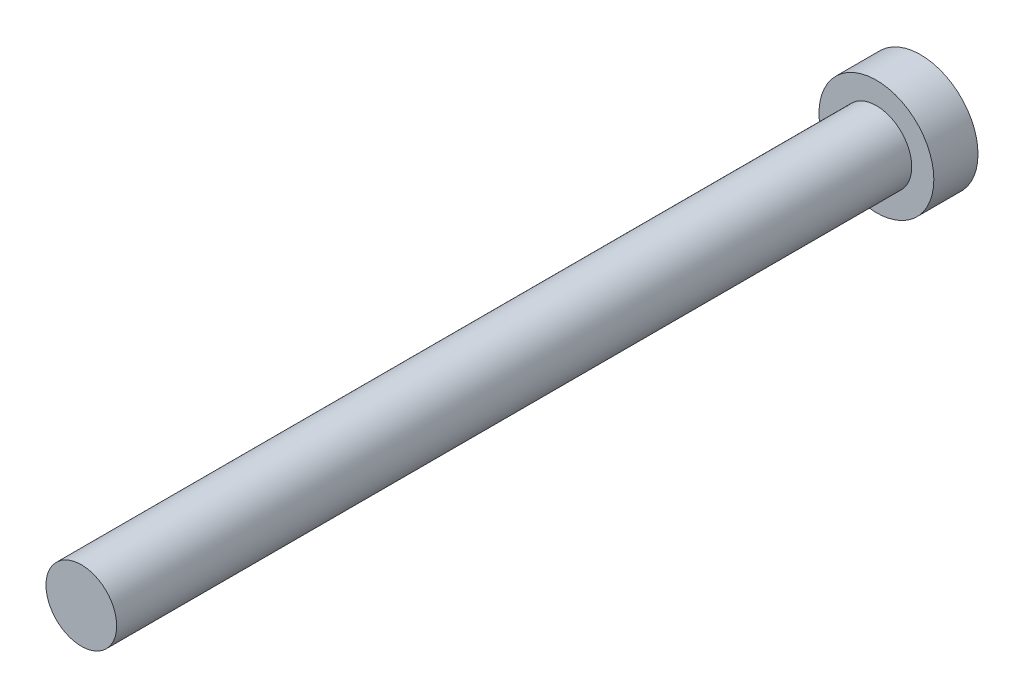
ISO-10303-21;
HEADER;
FILE_DESCRIPTION(('STEP AP214'),'2;1');
FILE_NAME('part.step','',(''),(''),'','','');
FILE_SCHEMA(('AUTOMOTIVE_DESIGN { 1 0 10303 214 1 1 1 1 }'));
ENDSEC;
DATA;
#1=APPLICATION_CONTEXT('core data for automotive mechanical design processes');
#2=APPLICATION_PROTOCOL_DEFINITION('international standard','automotive_design',2000,#1);
#3=PRODUCT_CONTEXT('',#1,'mechanical');
#4=PRODUCT('Part','Part','',(#3));
#5=PRODUCT_RELATED_PRODUCT_CATEGORY('part','',(#4));
#6=PRODUCT_DEFINITION_FORMATION('','',#4);
#7=PRODUCT_DEFINITION_CONTEXT('part definition',#1,'design');
#8=PRODUCT_DEFINITION('design','',#6,#7);
#9=PRODUCT_DEFINITION_SHAPE('','',#8);
#10=(LENGTH_UNIT() NAMED_UNIT(*) SI_UNIT(.MILLI.,.METRE.));
#11=(NAMED_UNIT(*) PLANE_ANGLE_UNIT() SI_UNIT($,.RADIAN.));
#12=(NAMED_UNIT(*) SI_UNIT($,.STERADIAN.) SOLID_ANGLE_UNIT());
#13=UNCERTAINTY_MEASURE_WITH_UNIT(LENGTH_MEASURE(1.E-05),#10,'distance_accuracy_value','');
#14=(GEOMETRIC_REPRESENTATION_CONTEXT(3) GLOBAL_UNCERTAINTY_ASSIGNED_CONTEXT((#13)) GLOBAL_UNIT_ASSIGNED_CONTEXT((#10,
#11,#12)) REPRESENTATION_CONTEXT('',''));
#15=CARTESIAN_POINT('',(0.,0.,0.));
#16=DIRECTION('',(0.,0.,1.));
#17=DIRECTION('',(1.,0.,0.));
#18=AXIS2_PLACEMENT_3D('',#15,#16,#17);
#19=CARTESIAN_POINT('',(0.,0.,5.));
#20=DIRECTION('',(0.,0.,-1.));
#21=DIRECTION('',(-1.,0.,0.));
#22=AXIS2_PLACEMENT_3D('',#19,#20,#21);
#23=CYLINDRICAL_SURFACE('',#22,6.5);
#24=CARTESIAN_POINT('',(0.,0.,5.));
#25=DIRECTION('',(0.,0.,1.));
#26=DIRECTION('',(1.,0.,0.));
#27=AXIS2_PLACEMENT_3D('',#24,#25,#26);
#28=CIRCLE('',#27,6.5);
#29=CARTESIAN_POINT('',(6.5,0.,5.));
#30=VERTEX_POINT('',#29);
#31=EDGE_CURVE('E45',#30,#30,#28,.T.);
#32=ORIENTED_EDGE('',*,*,#31,.F.);
#33=EDGE_LOOP('',(#32));
#34=FACE_BOUND('',#33,.T.);
#35=CARTESIAN_POINT('',(0.,0.,0.));
#36=DIRECTION('',(0.,0.,1.));
#37=DIRECTION('',(1.,0.,0.));
#38=AXIS2_PLACEMENT_3D('',#35,#36,#37);
#39=CIRCLE('',#38,6.5);
#40=CARTESIAN_POINT('',(6.5,0.,0.));
#41=VERTEX_POINT('',#40);
#42=EDGE_CURVE('E40',#41,#41,#39,.T.);
#43=ORIENTED_EDGE('',*,*,#42,.T.);
#44=EDGE_LOOP('',(#43));
#45=FACE_BOUND('',#44,.T.);
#46=ADVANCED_FACE('F37',(#34,#45),#23,.T.);
#47=CARTESIAN_POINT('',(0.,0.,5.));
#48=DIRECTION('',(0.,0.,1.));
#49=DIRECTION('',(1.,0.,0.));
#50=AXIS2_PLACEMENT_3D('',#47,#48,#49);
#51=PLANE('',#50);
#52=CARTESIAN_POINT('',(0.,0.,5.));
#53=DIRECTION('',(0.,0.,1.));
#54=DIRECTION('',(1.,0.,0.));
#55=AXIS2_PLACEMENT_3D('',#52,#53,#54);
#56=CIRCLE('',#55,4.);
#57=CARTESIAN_POINT('',(-4.,0.,4.99999999999999));
#58=VERTEX_POINT('',#57);
#59=EDGE_CURVE('E10',#58,#58,#56,.T.);
#60=ORIENTED_EDGE('',*,*,#59,.F.);
#61=EDGE_LOOP('',(#60));
#62=FACE_BOUND('',#61,.T.);
#63=ORIENTED_EDGE('',*,*,#31,.T.);
#64=EDGE_LOOP('',(#63));
#65=FACE_BOUND('',#64,.T.);
#66=ADVANCED_FACE('F65',(#62,#65),#51,.T.);
#67=CARTESIAN_POINT('',(0.,0.,0.));
#68=DIRECTION('',(0.,0.,1.));
#69=DIRECTION('',(1.,0.,0.));
#70=AXIS2_PLACEMENT_3D('',#67,#68,#69);
#71=PLANE('',#70);
#72=ORIENTED_EDGE('',*,*,#42,.F.);
#73=EDGE_LOOP('',(#72));
#74=FACE_BOUND('',#73,.T.);
#75=ADVANCED_FACE('F62',(#74),#71,.F.);
#76=CARTESIAN_POINT('',(0.,0.,95.));
#77=DIRECTION('',(0.,0.,-1.));
#78=DIRECTION('',(-1.,0.,0.));
#79=AXIS2_PLACEMENT_3D('',#76,#77,#78);
#80=CYLINDRICAL_SURFACE('',#79,4.);
#81=CARTESIAN_POINT('',(0.,0.,95.));
#82=DIRECTION('',(0.,0.,1.));
#83=DIRECTION('',(1.,0.,0.));
#84=AXIS2_PLACEMENT_3D('',#81,#82,#83);
#85=CIRCLE('',#84,4.);
#86=CARTESIAN_POINT('',(-4.,0.,95.));
#87=VERTEX_POINT('',#86);
#88=EDGE_CURVE('E52',#87,#87,#85,.T.);
#89=CARTESIAN_POINT('',(-4.,0.,95.));
#90=CARTESIAN_POINT('',(-4.,0.,94.0625));
#91=CARTESIAN_POINT('',(-4.,0.,93.125));
#92=CARTESIAN_POINT('',(-4.,0.,91.25));
#93=CARTESIAN_POINT('',(-4.,0.,90.3125));
#94=CARTESIAN_POINT('',(-4.,0.,88.4375));
#95=CARTESIAN_POINT('',(-4.,0.,87.5));
#96=CARTESIAN_POINT('',(-4.,0.,85.625));
#97=CARTESIAN_POINT('',(-4.,0.,84.6875));
#98=CARTESIAN_POINT('',(-4.,0.,82.8125));
#99=CARTESIAN_POINT('',(-4.,0.,81.875));
#100=CARTESIAN_POINT('',(-4.,0.,80.));
#101=CARTESIAN_POINT('',(-4.,0.,79.0625));
#102=CARTESIAN_POINT('',(-4.,0.,77.1875));
#103=CARTESIAN_POINT('',(-4.,0.,76.25));
#104=CARTESIAN_POINT('',(-4.,0.,74.375));
#105=CARTESIAN_POINT('',(-4.,0.,73.4375));
#106=CARTESIAN_POINT('',(-4.,0.,71.5625));
#107=CARTESIAN_POINT('',(-4.,0.,70.625));
#108=CARTESIAN_POINT('',(-4.,0.,68.75));
#109=CARTESIAN_POINT('',(-4.,0.,67.8125));
#110=CARTESIAN_POINT('',(-4.,0.,65.9375));
#111=CARTESIAN_POINT('',(-4.,0.,65.));
#112=CARTESIAN_POINT('',(-4.,0.,63.125));
#113=CARTESIAN_POINT('',(-4.,0.,62.1875));
#114=CARTESIAN_POINT('',(-4.,0.,60.3125));
#115=CARTESIAN_POINT('',(-4.,0.,59.375));
#116=CARTESIAN_POINT('',(-4.,0.,57.5));
#117=CARTESIAN_POINT('',(-4.,0.,56.5625));
#118=CARTESIAN_POINT('',(-4.,0.,54.6875));
#119=CARTESIAN_POINT('',(-4.,0.,53.75));
#120=CARTESIAN_POINT('',(-4.,0.,51.875));
#121=CARTESIAN_POINT('',(-4.,0.,50.9375));
#122=CARTESIAN_POINT('',(-4.,0.,49.0625));
#123=CARTESIAN_POINT('',(-4.,0.,48.125));
#124=CARTESIAN_POINT('',(-4.,0.,46.25));
#125=CARTESIAN_POINT('',(-4.,0.,45.3125));
#126=CARTESIAN_POINT('',(-4.,0.,43.4375));
#127=CARTESIAN_POINT('',(-4.,0.,42.5));
#128=CARTESIAN_POINT('',(-4.,0.,40.625));
#129=CARTESIAN_POINT('',(-4.,0.,39.6875));
#130=CARTESIAN_POINT('',(-4.,0.,37.8125));
#131=CARTESIAN_POINT('',(-4.,0.,36.875));
#132=CARTESIAN_POINT('',(-4.,0.,35.));
#133=CARTESIAN_POINT('',(-4.,0.,34.0625));
#134=CARTESIAN_POINT('',(-4.,0.,32.1875));
#135=CARTESIAN_POINT('',(-4.,0.,31.25));
#136=CARTESIAN_POINT('',(-4.,0.,29.375));
#137=CARTESIAN_POINT('',(-4.,0.,28.4375));
#138=CARTESIAN_POINT('',(-4.,0.,26.5625));
#139=CARTESIAN_POINT('',(-4.,0.,25.625));
#140=CARTESIAN_POINT('',(-4.,0.,23.75));
#141=CARTESIAN_POINT('',(-4.,0.,22.8125));
#142=CARTESIAN_POINT('',(-4.,0.,20.9375));
#143=CARTESIAN_POINT('',(-4.,0.,20.));
#144=CARTESIAN_POINT('',(-4.,0.,18.125));
#145=CARTESIAN_POINT('',(-4.,0.,17.1875));
#146=CARTESIAN_POINT('',(-4.,0.,15.3125));
#147=CARTESIAN_POINT('',(-4.,0.,14.375));
#148=CARTESIAN_POINT('',(-4.,0.,12.5));
#149=CARTESIAN_POINT('',(-4.,0.,11.5625));
#150=CARTESIAN_POINT('',(-4.,0.,9.68749999999999));
#151=CARTESIAN_POINT('',(-4.,0.,8.74999999999999));
#152=CARTESIAN_POINT('',(-4.,0.,6.87499999999999));
#153=CARTESIAN_POINT('',(-4.,0.,5.93749999999999));
#154=CARTESIAN_POINT('',(-4.,0.,4.99999999999999));
#155=B_SPLINE_CURVE_WITH_KNOTS('',3,(#89,#90,#91,#92,#93,#94,#95,#96,#97,#98,#99,#100,#101,#102,
#103,#104,#105,#106,#107,#108,#109,#110,#111,#112,#113,#114,#115,#116,#117,#118,#119,#120,#121,
#122,#123,#124,#125,#126,#127,#128,#129,#130,#131,#132,#133,#134,#135,#136,#137,#138,#139,#140,
#141,#142,#143,#144,#145,#146,#147,#148,#149,#150,#151,#152,#153,#154),.UNSPECIFIED.,.F.,.F.,(4,
2,2,2,2,2,2,2,2,2,2,2,2,2,2,2,2,2,2,2,2,2,2,2,2,2,2,2,2,2,2,2,4),(0.,2.8125,5.62499999999999,
8.43749999999999,11.25,14.0625,16.875,19.6875,22.5,25.3125,28.125,30.9375,33.75,36.5625,39.375,
42.1875,45.,47.8125,50.625,53.4375,56.25,59.0625,61.875,64.6875,67.5,70.3125,73.125,75.9375,
78.75,81.5625,84.375,87.1875,90.),.UNSPECIFIED.);
#156=EDGE_CURVE('BSEAM64',#87,#58,#155,.T.);
#157=ORIENTED_EDGE('',*,*,#88,.F.);
#158=ORIENTED_EDGE('',*,*,#59,.T.);
#159=ORIENTED_EDGE('',*,*,#156,.T.);
#160=ORIENTED_EDGE('',*,*,#156,.F.);
#161=EDGE_LOOP('',(#157,#159,#158,#160));
#162=FACE_BOUND('',#161,.T.);
#163=ADVANCED_FACE('F64',(#162),#80,.T.);
#164=CARTESIAN_POINT('',(0.,0.,95.));
#165=DIRECTION('',(0.,0.,1.));
#166=DIRECTION('',(1.,0.,0.));
#167=AXIS2_PLACEMENT_3D('',#164,#165,#166);
#168=PLANE('',#167);
#169=ORIENTED_EDGE('',*,*,#88,.T.);
#170=EDGE_LOOP('',(#169));
#171=FACE_BOUND('',#170,.T.);
#172=ADVANCED_FACE('F70',(#171),#168,.T.);
#173=CLOSED_SHELL('',(#46,#66,#75,#163,#172));
#174=MANIFOLD_SOLID_BREP('B2',#173);
#175=ADVANCED_BREP_SHAPE_REPRESENTATION('',(#18,#174),#14);
#176=SHAPE_DEFINITION_REPRESENTATION(#9,#175);
ENDSEC;
END-ISO-10303-21;
